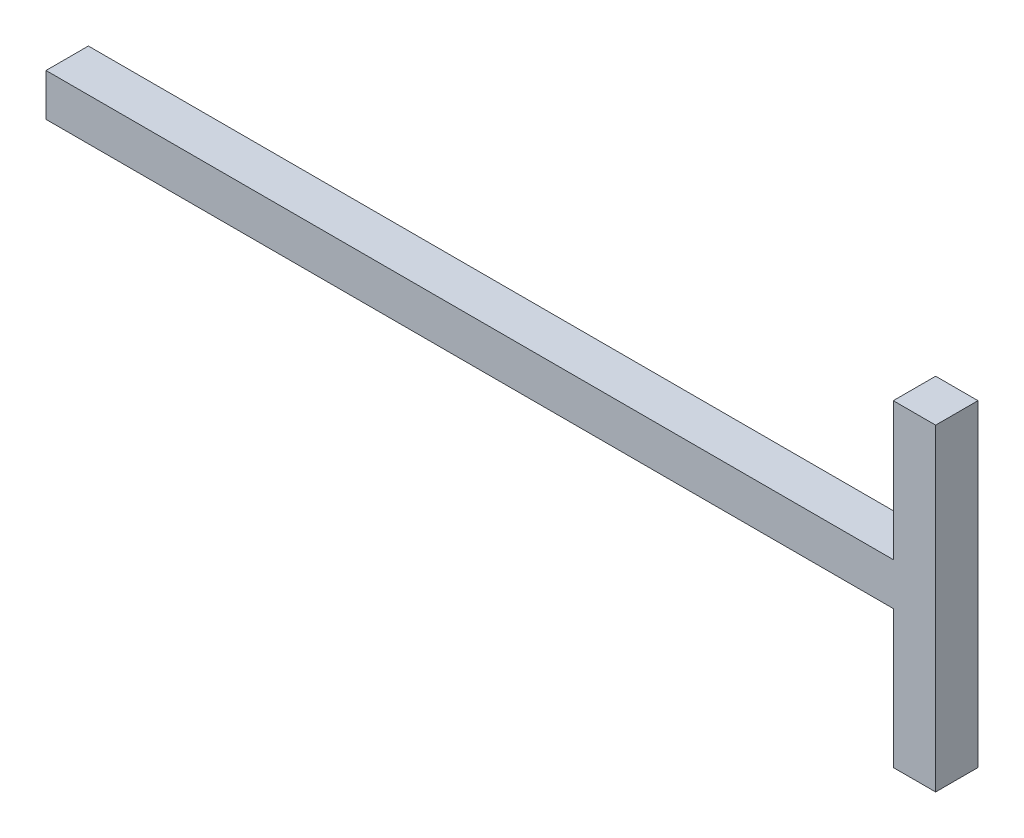
ISO-10303-21;
HEADER;
FILE_DESCRIPTION(('STEP AP214'),'2;1');
FILE_NAME('part.step','',(''),(''),'','','');
FILE_SCHEMA(('AUTOMOTIVE_DESIGN { 1 0 10303 214 1 1 1 1 }'));
ENDSEC;
DATA;
#1=APPLICATION_CONTEXT('core data for automotive mechanical design processes');
#2=APPLICATION_PROTOCOL_DEFINITION('international standard','automotive_design',2000,#1);
#3=PRODUCT_CONTEXT('',#1,'mechanical');
#4=PRODUCT('Part','Part','',(#3));
#5=PRODUCT_RELATED_PRODUCT_CATEGORY('part','',(#4));
#6=PRODUCT_DEFINITION_FORMATION('','',#4);
#7=PRODUCT_DEFINITION_CONTEXT('part definition',#1,'design');
#8=PRODUCT_DEFINITION('design','',#6,#7);
#9=PRODUCT_DEFINITION_SHAPE('','',#8);
#10=(LENGTH_UNIT() NAMED_UNIT(*) SI_UNIT(.MILLI.,.METRE.));
#11=(NAMED_UNIT(*) PLANE_ANGLE_UNIT() SI_UNIT($,.RADIAN.));
#12=(NAMED_UNIT(*) SI_UNIT($,.STERADIAN.) SOLID_ANGLE_UNIT());
#13=UNCERTAINTY_MEASURE_WITH_UNIT(LENGTH_MEASURE(1.E-05),#10,'distance_accuracy_value','');
#14=(GEOMETRIC_REPRESENTATION_CONTEXT(3) GLOBAL_UNCERTAINTY_ASSIGNED_CONTEXT((#13)) GLOBAL_UNIT_ASSIGNED_CONTEXT((#10,
#11,#12)) REPRESENTATION_CONTEXT('',''));
#15=CARTESIAN_POINT('',(0.,0.,0.));
#16=DIRECTION('',(0.,0.,1.));
#17=DIRECTION('',(1.,0.,0.));
#18=AXIS2_PLACEMENT_3D('',#15,#16,#17);
#19=CARTESIAN_POINT('',(-10.,150.,-10.));
#20=DIRECTION('',(1.,0.,0.));
#21=DIRECTION('',(0.,0.,-1.));
#22=AXIS2_PLACEMENT_3D('',#19,#20,#21);
#23=PLANE('',#22);
#24=DIRECTION('',(0.,0.,-1.));
#25=VECTOR('',#24,1.);
#26=CARTESIAN_POINT('',(-10.,85.,-10.));
#27=LINE('',#26,#25);
#28=CARTESIAN_POINT('',(-10.,85.,10.));
#29=VERTEX_POINT('',#28);
#30=CARTESIAN_POINT('',(-10.,85.,-10.));
#31=VERTEX_POINT('',#30);
#32=EDGE_CURVE('E117',#29,#31,#27,.T.);
#33=ORIENTED_EDGE('',*,*,#32,.F.);
#34=DIRECTION('',(0.,-1.,0.));
#35=VECTOR('',#34,1.);
#36=CARTESIAN_POINT('',(-10.,150.,10.));
#37=LINE('',#36,#35);
#38=CARTESIAN_POINT('',(-10.,150.,10.));
#39=VERTEX_POINT('',#38);
#40=EDGE_CURVE('E150',#39,#29,#37,.T.);
#41=ORIENTED_EDGE('',*,*,#40,.F.);
#42=DIRECTION('',(0.,0.,1.));
#43=VECTOR('',#42,1.);
#44=CARTESIAN_POINT('',(-10.,150.,-10.));
#45=LINE('',#44,#43);
#46=CARTESIAN_POINT('',(-10.,150.,-10.));
#47=VERTEX_POINT('',#46);
#48=EDGE_CURVE('E137',#47,#39,#45,.T.);
#49=ORIENTED_EDGE('',*,*,#48,.F.);
#50=DIRECTION('',(0.,-1.,0.));
#51=VECTOR('',#50,1.);
#52=CARTESIAN_POINT('',(-10.,150.,-10.));
#53=LINE('',#52,#51);
#54=EDGE_CURVE('E41',#47,#31,#53,.T.);
#55=ORIENTED_EDGE('',*,*,#54,.T.);
#56=EDGE_LOOP('',(#33,#41,#49,#55));
#57=FACE_BOUND('',#56,.T.);
#58=ADVANCED_FACE('F33',(#57),#23,.F.);
#59=DIRECTION('',(0.,0.,1.));
#60=VECTOR('',#59,1.);
#61=CARTESIAN_POINT('',(-10.,65.,-10.));
#62=LINE('',#61,#60);
#63=CARTESIAN_POINT('',(-10.,65.,-10.));
#64=VERTEX_POINT('',#63);
#65=CARTESIAN_POINT('',(-10.,65.,9.99999999999999));
#66=VERTEX_POINT('',#65);
#67=EDGE_CURVE('E48',#64,#66,#62,.T.);
#68=ORIENTED_EDGE('',*,*,#67,.F.);
#69=CARTESIAN_POINT('',(-10.,0.,-10.));
#70=VERTEX_POINT('',#69);
#71=EDGE_CURVE('E121',#64,#70,#53,.T.);
#72=ORIENTED_EDGE('',*,*,#71,.T.);
#73=DIRECTION('',(0.,0.,1.));
#74=VECTOR('',#73,1.);
#75=CARTESIAN_POINT('',(-10.,0.,-10.));
#76=LINE('',#75,#74);
#77=CARTESIAN_POINT('',(-10.,0.,10.));
#78=VERTEX_POINT('',#77);
#79=EDGE_CURVE('E143',#70,#78,#76,.T.);
#80=ORIENTED_EDGE('',*,*,#79,.T.);
#81=EDGE_CURVE('E149',#66,#78,#37,.T.);
#82=ORIENTED_EDGE('',*,*,#81,.F.);
#83=EDGE_LOOP('',(#68,#72,#80,#82));
#84=FACE_BOUND('',#83,.T.);
#85=ADVANCED_FACE('F152',(#84),#23,.F.);
#86=CARTESIAN_POINT('',(10.,150.,-10.));
#87=DIRECTION('',(-1.,0.,0.));
#88=DIRECTION('',(0.,0.,1.));
#89=AXIS2_PLACEMENT_3D('',#86,#87,#88);
#90=PLANE('',#89);
#91=DIRECTION('',(0.,0.,-1.));
#92=VECTOR('',#91,1.);
#93=CARTESIAN_POINT('',(10.,0.,-10.));
#94=LINE('',#93,#92);
#95=CARTESIAN_POINT('',(10.,0.,10.));
#96=VERTEX_POINT('',#95);
#97=CARTESIAN_POINT('',(10.,0.,-10.));
#98=VERTEX_POINT('',#97);
#99=EDGE_CURVE('E122',#96,#98,#94,.T.);
#100=ORIENTED_EDGE('',*,*,#99,.T.);
#101=DIRECTION('',(0.,-1.,0.));
#102=VECTOR('',#101,1.);
#103=CARTESIAN_POINT('',(10.,150.,-10.));
#104=LINE('',#103,#102);
#105=CARTESIAN_POINT('',(10.,150.,-10.));
#106=VERTEX_POINT('',#105);
#107=EDGE_CURVE('E11',#106,#98,#104,.T.);
#108=ORIENTED_EDGE('',*,*,#107,.F.);
#109=DIRECTION('',(0.,0.,-1.));
#110=VECTOR('',#109,1.);
#111=CARTESIAN_POINT('',(10.,150.,-10.));
#112=LINE('',#111,#110);
#113=CARTESIAN_POINT('',(10.,150.,10.));
#114=VERTEX_POINT('',#113);
#115=EDGE_CURVE('E131',#114,#106,#112,.T.);
#116=ORIENTED_EDGE('',*,*,#115,.F.);
#117=DIRECTION('',(0.,-1.,0.));
#118=VECTOR('',#117,1.);
#119=CARTESIAN_POINT('',(10.,150.,10.));
#120=LINE('',#119,#118);
#121=EDGE_CURVE('E140',#114,#96,#120,.T.);
#122=ORIENTED_EDGE('',*,*,#121,.T.);
#123=EDGE_LOOP('',(#100,#108,#116,#122));
#124=FACE_BOUND('',#123,.T.);
#125=ADVANCED_FACE('F35',(#124),#90,.F.);
#126=CARTESIAN_POINT('',(-10.,150.,-10.));
#127=DIRECTION('',(0.,0.,1.));
#128=DIRECTION('',(1.,0.,0.));
#129=AXIS2_PLACEMENT_3D('',#126,#127,#128);
#130=PLANE('',#129);
#131=DIRECTION('',(-1.,0.,0.));
#132=VECTOR('',#131,1.);
#133=CARTESIAN_POINT('',(-10.,0.,-10.));
#134=LINE('',#133,#132);
#135=EDGE_CURVE('E125',#98,#70,#134,.T.);
#136=ORIENTED_EDGE('',*,*,#135,.T.);
#137=ORIENTED_EDGE('',*,*,#71,.F.);
#138=DIRECTION('',(1.,0.,0.));
#139=VECTOR('',#138,1.);
#140=CARTESIAN_POINT('',(-410.,65.,-9.99999999999997));
#141=LINE('',#140,#139);
#142=CARTESIAN_POINT('',(-410.,65.,-9.99999999999997));
#143=VERTEX_POINT('',#142);
#144=EDGE_CURVE('E102',#143,#64,#141,.T.);
#145=ORIENTED_EDGE('',*,*,#144,.F.);
#146=DIRECTION('',(0.,-1.,0.));
#147=VECTOR('',#146,1.);
#148=CARTESIAN_POINT('',(-410.,85.,-9.99999999999997));
#149=LINE('',#148,#147);
#150=CARTESIAN_POINT('',(-410.,85.,-9.99999999999997));
#151=VERTEX_POINT('',#150);
#152=EDGE_CURVE('E108',#151,#143,#149,.T.);
#153=ORIENTED_EDGE('',*,*,#152,.F.);
#154=DIRECTION('',(1.,0.,0.));
#155=VECTOR('',#154,1.);
#156=CARTESIAN_POINT('',(-410.,85.,-9.99999999999997));
#157=LINE('',#156,#155);
#158=EDGE_CURVE('E172',#151,#31,#157,.T.);
#159=ORIENTED_EDGE('',*,*,#158,.T.);
#160=ORIENTED_EDGE('',*,*,#54,.F.);
#161=DIRECTION('',(-1.,0.,0.));
#162=VECTOR('',#161,1.);
#163=CARTESIAN_POINT('',(-10.,150.,-10.));
#164=LINE('',#163,#162);
#165=EDGE_CURVE('E134',#106,#47,#164,.T.);
#166=ORIENTED_EDGE('',*,*,#165,.F.);
#167=ORIENTED_EDGE('',*,*,#107,.T.);
#168=EDGE_LOOP('',(#136,#137,#145,#153,#159,#160,#166,#167));
#169=FACE_BOUND('',#168,.T.);
#170=ADVANCED_FACE('F120',(#169),#130,.F.);
#171=CARTESIAN_POINT('',(-10.,150.,10.));
#172=DIRECTION('',(0.,0.,-1.));
#173=DIRECTION('',(-1.,0.,0.));
#174=AXIS2_PLACEMENT_3D('',#171,#172,#173);
#175=PLANE('',#174);
#176=DIRECTION('',(1.,0.,0.));
#177=VECTOR('',#176,1.);
#178=CARTESIAN_POINT('',(-10.,0.,10.));
#179=LINE('',#178,#177);
#180=EDGE_CURVE('E135',#78,#96,#179,.T.);
#181=ORIENTED_EDGE('',*,*,#180,.T.);
#182=ORIENTED_EDGE('',*,*,#121,.F.);
#183=DIRECTION('',(1.,0.,0.));
#184=VECTOR('',#183,1.);
#185=CARTESIAN_POINT('',(-10.,150.,10.));
#186=LINE('',#185,#184);
#187=EDGE_CURVE('E139',#39,#114,#186,.T.);
#188=ORIENTED_EDGE('',*,*,#187,.F.);
#189=ORIENTED_EDGE('',*,*,#40,.T.);
#190=DIRECTION('',(1.,0.,0.));
#191=VECTOR('',#190,1.);
#192=CARTESIAN_POINT('',(-410.,85.,10.));
#193=LINE('',#192,#191);
#194=CARTESIAN_POINT('',(-410.,85.,10.));
#195=VERTEX_POINT('',#194);
#196=EDGE_CURVE('E127',#195,#29,#193,.T.);
#197=ORIENTED_EDGE('',*,*,#196,.F.);
#198=DIRECTION('',(0.,1.,0.));
#199=VECTOR('',#198,1.);
#200=CARTESIAN_POINT('',(-410.,85.,10.));
#201=LINE('',#200,#199);
#202=CARTESIAN_POINT('',(-410.,65.,10.));
#203=VERTEX_POINT('',#202);
#204=EDGE_CURVE('E107',#203,#195,#201,.T.);
#205=ORIENTED_EDGE('',*,*,#204,.F.);
#206=DIRECTION('',(1.,0.,0.));
#207=VECTOR('',#206,1.);
#208=CARTESIAN_POINT('',(-410.,65.,10.));
#209=LINE('',#208,#207);
#210=EDGE_CURVE('E104',#203,#66,#209,.T.);
#211=ORIENTED_EDGE('',*,*,#210,.T.);
#212=ORIENTED_EDGE('',*,*,#81,.T.);
#213=EDGE_LOOP('',(#181,#182,#188,#189,#197,#205,#211,#212));
#214=FACE_BOUND('',#213,.T.);
#215=ADVANCED_FACE('F161',(#214),#175,.F.);
#216=CARTESIAN_POINT('',(0.,150.,0.));
#217=DIRECTION('',(0.,1.,0.));
#218=DIRECTION('',(0.,0.,1.));
#219=AXIS2_PLACEMENT_3D('',#216,#217,#218);
#220=PLANE('',#219);
#221=ORIENTED_EDGE('',*,*,#115,.T.);
#222=ORIENTED_EDGE('',*,*,#165,.T.);
#223=ORIENTED_EDGE('',*,*,#48,.T.);
#224=ORIENTED_EDGE('',*,*,#187,.T.);
#225=EDGE_LOOP('',(#221,#222,#223,#224));
#226=FACE_BOUND('',#225,.T.);
#227=ADVANCED_FACE('F166',(#226),#220,.T.);
#228=CARTESIAN_POINT('',(0.,0.,0.));
#229=DIRECTION('',(0.,1.,0.));
#230=DIRECTION('',(0.,0.,1.));
#231=AXIS2_PLACEMENT_3D('',#228,#229,#230);
#232=PLANE('',#231);
#233=ORIENTED_EDGE('',*,*,#99,.F.);
#234=ORIENTED_EDGE('',*,*,#180,.F.);
#235=ORIENTED_EDGE('',*,*,#79,.F.);
#236=ORIENTED_EDGE('',*,*,#135,.F.);
#237=EDGE_LOOP('',(#233,#234,#235,#236));
#238=FACE_BOUND('',#237,.T.);
#239=ADVANCED_FACE('F158',(#238),#232,.F.);
#240=CARTESIAN_POINT('',(-410.,65.,-9.99999999999997));
#241=DIRECTION('',(0.,1.,0.));
#242=DIRECTION('',(0.,0.,1.));
#243=AXIS2_PLACEMENT_3D('',#240,#241,#242);
#244=PLANE('',#243);
#245=ORIENTED_EDGE('',*,*,#67,.T.);
#246=ORIENTED_EDGE('',*,*,#210,.F.);
#247=DIRECTION('',(0.,0.,1.));
#248=VECTOR('',#247,1.);
#249=CARTESIAN_POINT('',(-410.,65.,-9.99999999999997));
#250=LINE('',#249,#248);
#251=EDGE_CURVE('E98',#143,#203,#250,.T.);
#252=ORIENTED_EDGE('',*,*,#251,.F.);
#253=ORIENTED_EDGE('',*,*,#144,.T.);
#254=EDGE_LOOP('',(#245,#246,#252,#253));
#255=FACE_BOUND('',#254,.T.);
#256=ADVANCED_FACE('F100',(#255),#244,.F.);
#257=CARTESIAN_POINT('',(-410.,85.,-9.99999999999997));
#258=DIRECTION('',(0.,-1.,0.));
#259=DIRECTION('',(0.,0.,-1.));
#260=AXIS2_PLACEMENT_3D('',#257,#258,#259);
#261=PLANE('',#260);
#262=ORIENTED_EDGE('',*,*,#32,.T.);
#263=ORIENTED_EDGE('',*,*,#158,.F.);
#264=DIRECTION('',(0.,0.,-1.));
#265=VECTOR('',#264,1.);
#266=CARTESIAN_POINT('',(-410.,85.,-9.99999999999997));
#267=LINE('',#266,#265);
#268=EDGE_CURVE('E113',#195,#151,#267,.T.);
#269=ORIENTED_EDGE('',*,*,#268,.F.);
#270=ORIENTED_EDGE('',*,*,#196,.T.);
#271=EDGE_LOOP('',(#262,#263,#269,#270));
#272=FACE_BOUND('',#271,.T.);
#273=ADVANCED_FACE('F171',(#272),#261,.F.);
#274=CARTESIAN_POINT('',(-410.,0.,0.));
#275=DIRECTION('',(-1.,0.,0.));
#276=DIRECTION('',(0.,0.,1.));
#277=AXIS2_PLACEMENT_3D('',#274,#275,#276);
#278=PLANE('',#277);
#279=ORIENTED_EDGE('',*,*,#152,.T.);
#280=ORIENTED_EDGE('',*,*,#251,.T.);
#281=ORIENTED_EDGE('',*,*,#204,.T.);
#282=ORIENTED_EDGE('',*,*,#268,.T.);
#283=EDGE_LOOP('',(#279,#280,#281,#282));
#284=FACE_BOUND('',#283,.T.);
#285=ADVANCED_FACE('F111',(#284),#278,.T.);
#286=CLOSED_SHELL('',(#58,#85,#125,#170,#215,#227,#239,#256,#273,#285));
#287=MANIFOLD_SOLID_BREP('B2',#286);
#288=ADVANCED_BREP_SHAPE_REPRESENTATION('',(#18,#287),#14);
#289=SHAPE_DEFINITION_REPRESENTATION(#9,#288);
ENDSEC;
END-ISO-10303-21;
